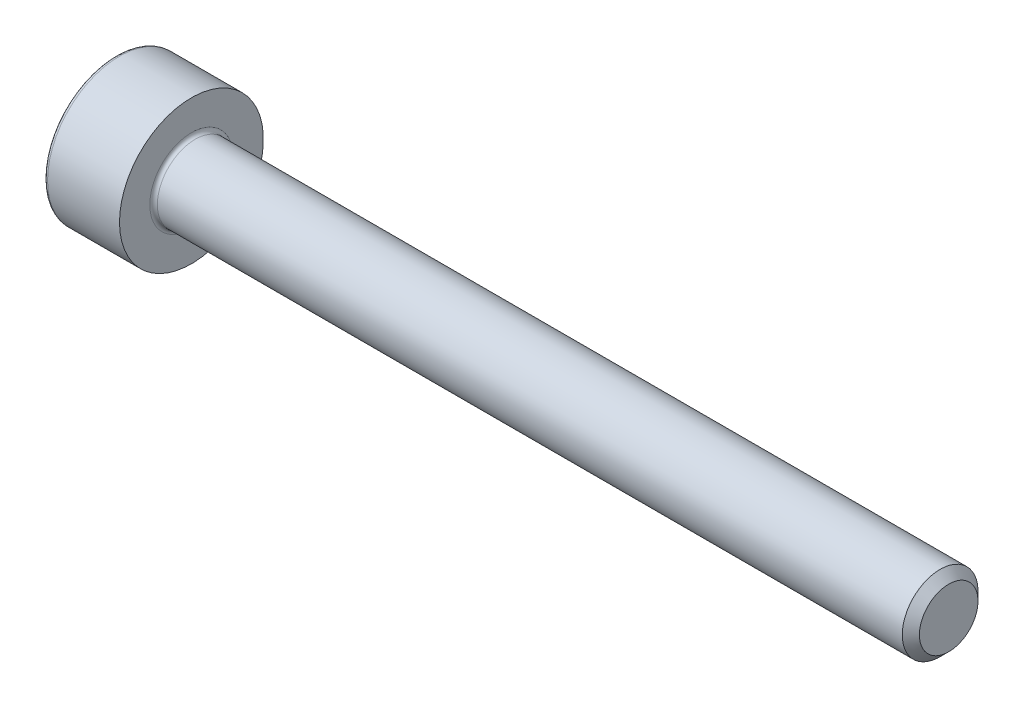
ISO-10303-21;
HEADER;
FILE_DESCRIPTION(('STEP AP214'),'2;1');
FILE_NAME('part.step','',(''),(''),'','','');
FILE_SCHEMA(('AUTOMOTIVE_DESIGN { 1 0 10303 214 1 1 1 1 }'));
ENDSEC;
DATA;
#1=APPLICATION_CONTEXT('core data for automotive mechanical design processes');
#2=APPLICATION_PROTOCOL_DEFINITION('international standard','automotive_design',2000,#1);
#3=PRODUCT_CONTEXT('',#1,'mechanical');
#4=PRODUCT('Part','Part','',(#3));
#5=PRODUCT_RELATED_PRODUCT_CATEGORY('part','',(#4));
#6=PRODUCT_DEFINITION_FORMATION('','',#4);
#7=PRODUCT_DEFINITION_CONTEXT('part definition',#1,'design');
#8=PRODUCT_DEFINITION('design','',#6,#7);
#9=PRODUCT_DEFINITION_SHAPE('','',#8);
#10=(LENGTH_UNIT() NAMED_UNIT(*) SI_UNIT(.MILLI.,.METRE.));
#11=(NAMED_UNIT(*) PLANE_ANGLE_UNIT() SI_UNIT($,.RADIAN.));
#12=(NAMED_UNIT(*) SI_UNIT($,.STERADIAN.) SOLID_ANGLE_UNIT());
#13=UNCERTAINTY_MEASURE_WITH_UNIT(LENGTH_MEASURE(1.E-05),#10,'distance_accuracy_value','');
#14=(GEOMETRIC_REPRESENTATION_CONTEXT(3) GLOBAL_UNCERTAINTY_ASSIGNED_CONTEXT((#13)) GLOBAL_UNIT_ASSIGNED_CONTEXT((#10,
#11,#12)) REPRESENTATION_CONTEXT('',''));
#15=CARTESIAN_POINT('',(0.,0.,0.));
#16=DIRECTION('',(0.,0.,1.));
#17=DIRECTION('',(1.,0.,0.));
#18=AXIS2_PLACEMENT_3D('',#15,#16,#17);
#19=CARTESIAN_POINT('',(0.,0.,0.));
#20=DIRECTION('',(-1.,0.,0.));
#21=DIRECTION('',(0.,0.,1.));
#22=AXIS2_PLACEMENT_3D('',#19,#20,#21);
#23=PLANE('',#22);
#24=DIRECTION('',(0.,-0.5,0.86602540378444));
#25=VECTOR('',#24,1.);
#26=CARTESIAN_POINT('',(0.,0.892006165897969,0.));
#27=LINE('',#26,#25);
#28=CARTESIAN_POINT('',(0.,0.892006165897969,0.));
#29=VERTEX_POINT('',#28);
#30=CARTESIAN_POINT('',(0.,0.446003082948984,0.7725));
#31=VERTEX_POINT('',#30);
#32=EDGE_CURVE('E253',#29,#31,#27,.T.);
#33=ORIENTED_EDGE('',*,*,#32,.T.);
#34=DIRECTION('',(0.,1.,0.));
#35=VECTOR('',#34,1.);
#36=CARTESIAN_POINT('',(0.,-0.446003082948988,0.7725));
#37=LINE('',#36,#35);
#38=CARTESIAN_POINT('',(0.,-0.446003082948988,0.7725));
#39=VERTEX_POINT('',#38);
#40=EDGE_CURVE('E108',#39,#31,#37,.T.);
#41=ORIENTED_EDGE('',*,*,#40,.F.);
#42=DIRECTION('',(0.,-0.5,-0.866025403784438));
#43=VECTOR('',#42,1.);
#44=CARTESIAN_POINT('',(0.,-0.446003082948988,0.7725));
#45=LINE('',#44,#43);
#46=CARTESIAN_POINT('',(0.,-0.892006165897974,0.));
#47=VERTEX_POINT('',#46);
#48=EDGE_CURVE('E256',#39,#47,#45,.T.);
#49=ORIENTED_EDGE('',*,*,#48,.T.);
#50=DIRECTION('',(0.,0.5,-0.86602540378444));
#51=VECTOR('',#50,1.);
#52=CARTESIAN_POINT('',(0.,-0.892006165897974,0.));
#53=LINE('',#52,#51);
#54=CARTESIAN_POINT('',(0.,-0.44600308294899,-0.7725));
#55=VERTEX_POINT('',#54);
#56=EDGE_CURVE('E259',#47,#55,#53,.T.);
#57=ORIENTED_EDGE('',*,*,#56,.T.);
#58=DIRECTION('',(0.,-1.,0.));
#59=VECTOR('',#58,1.);
#60=CARTESIAN_POINT('',(0.,0.446003082948982,-0.7725));
#61=LINE('',#60,#59);
#62=CARTESIAN_POINT('',(0.,0.446003082948982,-0.7725));
#63=VERTEX_POINT('',#62);
#64=EDGE_CURVE('E262',#63,#55,#61,.T.);
#65=ORIENTED_EDGE('',*,*,#64,.F.);
#66=DIRECTION('',(0.,-0.5,-0.866025403784438));
#67=VECTOR('',#66,1.);
#68=CARTESIAN_POINT('',(0.,0.892006165897969,0.));
#69=LINE('',#68,#67);
#70=EDGE_CURVE('E103',#29,#63,#69,.T.);
#71=ORIENTED_EDGE('',*,*,#70,.F.);
#72=EDGE_LOOP('',(#33,#41,#49,#57,#65,#71));
#73=FACE_BOUND('',#72,.T.);
#74=CARTESIAN_POINT('',(0.,0.,0.));
#75=DIRECTION('',(-1.,0.,0.));
#76=DIRECTION('',(0.,0.,1.));
#77=AXIS2_PLACEMENT_3D('',#74,#75,#76);
#78=CIRCLE('',#77,1.8);
#79=CARTESIAN_POINT('',(0.,0.,1.8));
#80=VERTEX_POINT('',#79);
#81=EDGE_CURVE('E24',#80,#80,#78,.T.);
#82=ORIENTED_EDGE('',*,*,#81,.T.);
#83=EDGE_LOOP('',(#82));
#84=FACE_BOUND('',#83,.T.);
#85=ADVANCED_FACE('F16',(#73,#84),#23,.T.);
#86=CARTESIAN_POINT('',(-31.75,0.,0.));
#87=DIRECTION('',(-1.,0.,0.));
#88=DIRECTION('',(0.,0.,1.));
#89=AXIS2_PLACEMENT_3D('',#86,#87,#88);
#90=CYLINDRICAL_SURFACE('',#89,1.9);
#91=CARTESIAN_POINT('',(0.100000000000003,0.,0.));
#92=DIRECTION('',(-1.,0.,0.));
#93=DIRECTION('',(0.,0.,1.));
#94=AXIS2_PLACEMENT_3D('',#91,#92,#93);
#95=CIRCLE('',#94,1.9);
#96=CARTESIAN_POINT('',(0.100000000000003,0.,1.9));
#97=VERTEX_POINT('',#96);
#98=EDGE_CURVE('E11',#97,#97,#95,.F.);
#99=ORIENTED_EDGE('',*,*,#98,.T.);
#100=EDGE_LOOP('',(#99));
#101=FACE_BOUND('',#100,.T.);
#102=CARTESIAN_POINT('',(2.,0.,0.));
#103=DIRECTION('',(-1.,0.,0.));
#104=DIRECTION('',(0.,0.,1.));
#105=AXIS2_PLACEMENT_3D('',#102,#103,#104);
#106=CIRCLE('',#105,1.9);
#107=CARTESIAN_POINT('',(2.,0.,1.9));
#108=VERTEX_POINT('',#107);
#109=EDGE_CURVE('E126',#108,#108,#106,.T.);
#110=ORIENTED_EDGE('',*,*,#109,.T.);
#111=EDGE_LOOP('',(#110));
#112=FACE_BOUND('',#111,.T.);
#113=ADVANCED_FACE('F152',(#101,#112),#90,.T.);
#114=CARTESIAN_POINT('',(2.,1.9,0.));
#115=DIRECTION('',(1.,0.,0.));
#116=DIRECTION('',(0.,0.,-1.));
#117=AXIS2_PLACEMENT_3D('',#114,#115,#116);
#118=PLANE('',#117);
#119=CARTESIAN_POINT('',(2.,0.,0.));
#120=DIRECTION('',(1.,0.,0.));
#121=DIRECTION('',(0.,0.,-1.));
#122=AXIS2_PLACEMENT_3D('',#119,#120,#121);
#123=CIRCLE('',#122,1.1);
#124=CARTESIAN_POINT('',(2.,0.,-1.1));
#125=VERTEX_POINT('',#124);
#126=EDGE_CURVE('E129',#125,#125,#123,.F.);
#127=ORIENTED_EDGE('',*,*,#126,.T.);
#128=EDGE_LOOP('',(#127));
#129=FACE_BOUND('',#128,.T.);
#130=ORIENTED_EDGE('',*,*,#109,.F.);
#131=EDGE_LOOP('',(#130));
#132=FACE_BOUND('',#131,.T.);
#133=ADVANCED_FACE('F159',(#129,#132),#118,.T.);
#134=CARTESIAN_POINT('',(-31.75,0.,0.));
#135=DIRECTION('',(-1.,0.,0.));
#136=DIRECTION('',(0.,0.,1.));
#137=AXIS2_PLACEMENT_3D('',#134,#135,#136);
#138=CYLINDRICAL_SURFACE('',#137,1.);
#139=CARTESIAN_POINT('',(2.1,0.,0.));
#140=DIRECTION('',(1.,0.,0.));
#141=DIRECTION('',(0.,0.,-1.));
#142=AXIS2_PLACEMENT_3D('',#139,#140,#141);
#143=CIRCLE('',#142,1.);
#144=CARTESIAN_POINT('',(2.1,0.,-1.));
#145=VERTEX_POINT('',#144);
#146=EDGE_CURVE('E132',#145,#145,#143,.T.);
#147=ORIENTED_EDGE('',*,*,#146,.T.);
#148=EDGE_LOOP('',(#147));
#149=FACE_BOUND('',#148,.T.);
#150=CARTESIAN_POINT('',(21.774,0.,0.));
#151=DIRECTION('',(-1.,0.,0.));
#152=DIRECTION('',(0.,0.,1.));
#153=AXIS2_PLACEMENT_3D('',#150,#151,#152);
#154=CIRCLE('',#153,0.999999999999987);
#155=CARTESIAN_POINT('',(21.774,0.,0.999999999999987));
#156=VERTEX_POINT('',#155);
#157=EDGE_CURVE('E123',#156,#156,#154,.T.);
#158=ORIENTED_EDGE('',*,*,#157,.T.);
#159=EDGE_LOOP('',(#158));
#160=FACE_BOUND('',#159,.T.);
#161=ADVANCED_FACE('F165',(#149,#160),#138,.T.);
#162=CARTESIAN_POINT('',(22.,0.,0.));
#163=DIRECTION('',(-1.,0.,0.));
#164=DIRECTION('',(0.,0.,1.));
#165=AXIS2_PLACEMENT_3D('',#162,#163,#164);
#166=CONICAL_SURFACE('',#165,0.774,0.785398163397411);
#167=ORIENTED_EDGE('',*,*,#157,.F.);
#168=EDGE_LOOP('',(#167));
#169=FACE_BOUND('',#168,.T.);
#170=CARTESIAN_POINT('',(22.,0.,0.));
#171=DIRECTION('',(-1.,0.,0.));
#172=DIRECTION('',(0.,0.,1.));
#173=AXIS2_PLACEMENT_3D('',#170,#171,#172);
#174=CIRCLE('',#173,0.774);
#175=CARTESIAN_POINT('',(22.,0.,0.774));
#176=VERTEX_POINT('',#175);
#177=EDGE_CURVE('E119',#176,#176,#174,.T.);
#178=ORIENTED_EDGE('',*,*,#177,.T.);
#179=EDGE_LOOP('',(#178));
#180=FACE_BOUND('',#179,.T.);
#181=ADVANCED_FACE('F169',(#169,#180),#166,.T.);
#182=CARTESIAN_POINT('',(22.,0.774,0.));
#183=DIRECTION('',(1.,0.,0.));
#184=DIRECTION('',(0.,0.,-1.));
#185=AXIS2_PLACEMENT_3D('',#182,#183,#184);
#186=PLANE('',#185);
#187=ORIENTED_EDGE('',*,*,#177,.F.);
#188=EDGE_LOOP('',(#187));
#189=FACE_BOUND('',#188,.T.);
#190=ADVANCED_FACE('F148',(#189),#186,.T.);
#191=CARTESIAN_POINT('',(2.1,0.,0.));
#192=DIRECTION('',(1.,0.,0.));
#193=DIRECTION('',(0.,0.,-1.));
#194=AXIS2_PLACEMENT_3D('',#191,#192,#193);
#195=TOROIDAL_SURFACE('',#194,1.1,0.1);
#196=ORIENTED_EDGE('',*,*,#146,.F.);
#197=EDGE_LOOP('',(#196));
#198=FACE_BOUND('',#197,.T.);
#199=ORIENTED_EDGE('',*,*,#126,.F.);
#200=EDGE_LOOP('',(#199));
#201=FACE_BOUND('',#200,.T.);
#202=ADVANCED_FACE('F139',(#198,#201),#195,.F.);
#203=CARTESIAN_POINT('',(0.100000000000003,0.,0.));
#204=DIRECTION('',(-1.,0.,0.));
#205=DIRECTION('',(0.,0.,1.));
#206=AXIS2_PLACEMENT_3D('',#203,#204,#205);
#207=TOROIDAL_SURFACE('',#206,1.8,0.1);
#208=ORIENTED_EDGE('',*,*,#98,.F.);
#209=EDGE_LOOP('',(#208));
#210=FACE_BOUND('',#209,.T.);
#211=ORIENTED_EDGE('',*,*,#81,.F.);
#212=EDGE_LOOP('',(#211));
#213=FACE_BOUND('',#212,.T.);
#214=ADVANCED_FACE('F18',(#210,#213),#207,.T.);
#215=CARTESIAN_POINT('',(1.,0.892006165897969,0.));
#216=DIRECTION('',(0.,-0.86602540378444,-0.5));
#217=DIRECTION('',(0.,0.5,-0.86602540378444));
#218=AXIS2_PLACEMENT_3D('',#215,#216,#217);
#219=PLANE('',#218);
#220=ORIENTED_EDGE('',*,*,#32,.F.);
#221=DIRECTION('',(-1.,0.,0.));
#222=VECTOR('',#221,1.);
#223=CARTESIAN_POINT('',(1.,0.892006165897969,0.));
#224=LINE('',#223,#222);
#225=CARTESIAN_POINT('',(1.,0.892006165897969,0.));
#226=VERTEX_POINT('',#225);
#227=EDGE_CURVE('E252',#226,#29,#224,.T.);
#228=ORIENTED_EDGE('',*,*,#227,.F.);
#229=DIRECTION('',(0.,-0.5,0.86602540378444));
#230=VECTOR('',#229,1.);
#231=CARTESIAN_POINT('',(1.,0.892006165897969,0.));
#232=LINE('',#231,#230);
#233=CARTESIAN_POINT('',(1.,0.66900462442348,0.38625));
#234=VERTEX_POINT('',#233);
#235=EDGE_CURVE('E31',#226,#234,#232,.T.);
#236=ORIENTED_EDGE('',*,*,#235,.T.);
#237=CARTESIAN_POINT('',(1.,0.446003082948984,0.7725));
#238=VERTEX_POINT('',#237);
#239=EDGE_CURVE('E89',#234,#238,#232,.T.);
#240=ORIENTED_EDGE('',*,*,#239,.T.);
#241=DIRECTION('',(-1.,0.,0.));
#242=VECTOR('',#241,1.);
#243=CARTESIAN_POINT('',(1.,0.446003082948984,0.7725));
#244=LINE('',#243,#242);
#245=EDGE_CURVE('E101',#238,#31,#244,.T.);
#246=ORIENTED_EDGE('',*,*,#245,.T.);
#247=EDGE_LOOP('',(#220,#228,#236,#240,#246));
#248=FACE_BOUND('',#247,.T.);
#249=ADVANCED_FACE('F100',(#248),#219,.T.);
#250=CARTESIAN_POINT('',(1.,-0.446003082948988,0.7725));
#251=DIRECTION('',(0.,0.,1.));
#252=DIRECTION('',(0.,-1.,0.));
#253=AXIS2_PLACEMENT_3D('',#250,#251,#252);
#254=PLANE('',#253);
#255=ORIENTED_EDGE('',*,*,#40,.T.);
#256=ORIENTED_EDGE('',*,*,#245,.F.);
#257=DIRECTION('',(0.,1.,0.));
#258=VECTOR('',#257,1.);
#259=CARTESIAN_POINT('',(1.,-0.446003082948988,0.7725));
#260=LINE('',#259,#258);
#261=CARTESIAN_POINT('',(1.,0.,0.7725));
#262=VERTEX_POINT('',#261);
#263=EDGE_CURVE('E87',#262,#238,#260,.T.);
#264=ORIENTED_EDGE('',*,*,#263,.F.);
#265=CARTESIAN_POINT('',(1.,-0.446003082948988,0.7725));
#266=VERTEX_POINT('',#265);
#267=EDGE_CURVE('E97',#266,#262,#260,.T.);
#268=ORIENTED_EDGE('',*,*,#267,.F.);
#269=DIRECTION('',(-1.,0.,0.));
#270=VECTOR('',#269,1.);
#271=CARTESIAN_POINT('',(1.,-0.446003082948988,0.7725));
#272=LINE('',#271,#270);
#273=EDGE_CURVE('E110',#266,#39,#272,.T.);
#274=ORIENTED_EDGE('',*,*,#273,.T.);
#275=EDGE_LOOP('',(#255,#256,#264,#268,#274));
#276=FACE_BOUND('',#275,.T.);
#277=ADVANCED_FACE('F105',(#276),#254,.F.);
#278=CARTESIAN_POINT('',(1.,-0.446003082948988,0.7725));
#279=DIRECTION('',(0.,0.866025403784438,-0.5));
#280=DIRECTION('',(0.,0.5,0.866025403784438));
#281=AXIS2_PLACEMENT_3D('',#278,#279,#280);
#282=PLANE('',#281);
#283=ORIENTED_EDGE('',*,*,#48,.F.);
#284=ORIENTED_EDGE('',*,*,#273,.F.);
#285=DIRECTION('',(0.,-0.5,-0.866025403784438));
#286=VECTOR('',#285,1.);
#287=CARTESIAN_POINT('',(1.,-0.446003082948988,0.7725));
#288=LINE('',#287,#286);
#289=CARTESIAN_POINT('',(1.,-0.669004624423479,0.38625));
#290=VERTEX_POINT('',#289);
#291=EDGE_CURVE('E233',#266,#290,#288,.T.);
#292=ORIENTED_EDGE('',*,*,#291,.T.);
#293=CARTESIAN_POINT('',(1.,-0.892006165897974,0.));
#294=VERTEX_POINT('',#293);
#295=EDGE_CURVE('E235',#290,#294,#288,.T.);
#296=ORIENTED_EDGE('',*,*,#295,.T.);
#297=DIRECTION('',(-1.,0.,0.));
#298=VECTOR('',#297,1.);
#299=CARTESIAN_POINT('',(1.,-0.892006165897974,0.));
#300=LINE('',#299,#298);
#301=EDGE_CURVE('E115',#294,#47,#300,.T.);
#302=ORIENTED_EDGE('',*,*,#301,.T.);
#303=EDGE_LOOP('',(#283,#284,#292,#296,#302));
#304=FACE_BOUND('',#303,.T.);
#305=ADVANCED_FACE('F182',(#304),#282,.T.);
#306=CARTESIAN_POINT('',(1.,-0.892006165897974,0.));
#307=DIRECTION('',(0.,0.86602540378444,0.5));
#308=DIRECTION('',(0.,-0.5,0.86602540378444));
#309=AXIS2_PLACEMENT_3D('',#306,#307,#308);
#310=PLANE('',#309);
#311=ORIENTED_EDGE('',*,*,#56,.F.);
#312=ORIENTED_EDGE('',*,*,#301,.F.);
#313=DIRECTION('',(0.,0.5,-0.86602540378444));
#314=VECTOR('',#313,1.);
#315=CARTESIAN_POINT('',(1.,-0.892006165897974,0.));
#316=LINE('',#315,#314);
#317=CARTESIAN_POINT('',(1.,-0.669004624423483,-0.38625));
#318=VERTEX_POINT('',#317);
#319=EDGE_CURVE('E238',#294,#318,#316,.T.);
#320=ORIENTED_EDGE('',*,*,#319,.T.);
#321=CARTESIAN_POINT('',(1.,-0.44600308294899,-0.7725));
#322=VERTEX_POINT('',#321);
#323=EDGE_CURVE('E242',#318,#322,#316,.T.);
#324=ORIENTED_EDGE('',*,*,#323,.T.);
#325=DIRECTION('',(-1.,0.,0.));
#326=VECTOR('',#325,1.);
#327=CARTESIAN_POINT('',(1.,-0.44600308294899,-0.7725));
#328=LINE('',#327,#326);
#329=EDGE_CURVE('E271',#322,#55,#328,.T.);
#330=ORIENTED_EDGE('',*,*,#329,.T.);
#331=EDGE_LOOP('',(#311,#312,#320,#324,#330));
#332=FACE_BOUND('',#331,.T.);
#333=ADVANCED_FACE('F185',(#332),#310,.T.);
#334=CARTESIAN_POINT('',(1.,0.446003082948982,-0.7725));
#335=DIRECTION('',(0.,0.,-1.));
#336=DIRECTION('',(0.,1.,0.));
#337=AXIS2_PLACEMENT_3D('',#334,#335,#336);
#338=PLANE('',#337);
#339=ORIENTED_EDGE('',*,*,#64,.T.);
#340=ORIENTED_EDGE('',*,*,#329,.F.);
#341=DIRECTION('',(0.,-1.,0.));
#342=VECTOR('',#341,1.);
#343=CARTESIAN_POINT('',(1.,0.446003082948982,-0.7725));
#344=LINE('',#343,#342);
#345=CARTESIAN_POINT('',(1.,0.,-0.7725));
#346=VERTEX_POINT('',#345);
#347=EDGE_CURVE('E246',#346,#322,#344,.T.);
#348=ORIENTED_EDGE('',*,*,#347,.F.);
#349=CARTESIAN_POINT('',(1.,0.446003082948982,-0.7725));
#350=VERTEX_POINT('',#349);
#351=EDGE_CURVE('E247',#350,#346,#344,.T.);
#352=ORIENTED_EDGE('',*,*,#351,.F.);
#353=DIRECTION('',(-1.,0.,0.));
#354=VECTOR('',#353,1.);
#355=CARTESIAN_POINT('',(1.,0.446003082948982,-0.7725));
#356=LINE('',#355,#354);
#357=EDGE_CURVE('E268',#350,#63,#356,.T.);
#358=ORIENTED_EDGE('',*,*,#357,.T.);
#359=EDGE_LOOP('',(#339,#340,#348,#352,#358));
#360=FACE_BOUND('',#359,.T.);
#361=ADVANCED_FACE('F189',(#360),#338,.F.);
#362=CARTESIAN_POINT('',(1.,0.892006165897969,0.));
#363=DIRECTION('',(0.,0.866025403784438,-0.5));
#364=DIRECTION('',(0.,0.5,0.866025403784438));
#365=AXIS2_PLACEMENT_3D('',#362,#363,#364);
#366=PLANE('',#365);
#367=ORIENTED_EDGE('',*,*,#70,.T.);
#368=ORIENTED_EDGE('',*,*,#357,.F.);
#369=DIRECTION('',(0.,-0.5,-0.866025403784438));
#370=VECTOR('',#369,1.);
#371=CARTESIAN_POINT('',(1.,0.892006165897969,0.));
#372=LINE('',#371,#370);
#373=CARTESIAN_POINT('',(1.,0.669004624423477,-0.38625));
#374=VERTEX_POINT('',#373);
#375=EDGE_CURVE('E250',#374,#350,#372,.T.);
#376=ORIENTED_EDGE('',*,*,#375,.F.);
#377=EDGE_CURVE('E224',#226,#374,#372,.T.);
#378=ORIENTED_EDGE('',*,*,#377,.F.);
#379=ORIENTED_EDGE('',*,*,#227,.T.);
#380=EDGE_LOOP('',(#367,#368,#376,#378,#379));
#381=FACE_BOUND('',#380,.T.);
#382=ADVANCED_FACE('F193',(#381),#366,.F.);
#383=CARTESIAN_POINT('',(1.,0.446003082948983,0.7725));
#384=DIRECTION('',(-1.,0.,0.));
#385=DIRECTION('',(0.,0.,1.));
#386=AXIS2_PLACEMENT_3D('',#383,#384,#385);
#387=PLANE('',#386);
#388=CARTESIAN_POINT('',(1.,0.,0.));
#389=DIRECTION('',(-1.,0.,0.));
#390=DIRECTION('',(0.,0.,1.));
#391=AXIS2_PLACEMENT_3D('',#388,#389,#390);
#392=CIRCLE('',#391,0.7725);
#393=EDGE_CURVE('E109',#290,#262,#392,.T.);
#394=ORIENTED_EDGE('',*,*,#393,.F.);
#395=ORIENTED_EDGE('',*,*,#291,.F.);
#396=ORIENTED_EDGE('',*,*,#267,.T.);
#397=EDGE_LOOP('',(#394,#395,#396));
#398=FACE_BOUND('',#397,.T.);
#399=ADVANCED_FACE('F197',(#398),#387,.T.);
#400=EDGE_CURVE('E113',#318,#290,#392,.T.);
#401=ORIENTED_EDGE('',*,*,#400,.F.);
#402=ORIENTED_EDGE('',*,*,#319,.F.);
#403=ORIENTED_EDGE('',*,*,#295,.F.);
#404=EDGE_LOOP('',(#401,#402,#403));
#405=FACE_BOUND('',#404,.T.);
#406=ADVANCED_FACE('F200',(#405),#387,.T.);
#407=EDGE_CURVE('E277',#346,#318,#392,.T.);
#408=ORIENTED_EDGE('',*,*,#407,.F.);
#409=ORIENTED_EDGE('',*,*,#347,.T.);
#410=ORIENTED_EDGE('',*,*,#323,.F.);
#411=EDGE_LOOP('',(#408,#409,#410));
#412=FACE_BOUND('',#411,.T.);
#413=ADVANCED_FACE('F206',(#412),#387,.T.);
#414=EDGE_CURVE('E227',#374,#346,#392,.T.);
#415=ORIENTED_EDGE('',*,*,#414,.F.);
#416=ORIENTED_EDGE('',*,*,#375,.T.);
#417=ORIENTED_EDGE('',*,*,#351,.T.);
#418=EDGE_LOOP('',(#415,#416,#417));
#419=FACE_BOUND('',#418,.T.);
#420=ADVANCED_FACE('F214',(#419),#387,.T.);
#421=EDGE_CURVE('E120',#234,#374,#392,.T.);
#422=ORIENTED_EDGE('',*,*,#421,.F.);
#423=ORIENTED_EDGE('',*,*,#235,.F.);
#424=ORIENTED_EDGE('',*,*,#377,.T.);
#425=EDGE_LOOP('',(#422,#423,#424));
#426=FACE_BOUND('',#425,.T.);
#427=ADVANCED_FACE('F209',(#426),#387,.T.);
#428=EDGE_CURVE('E92',#262,#234,#392,.T.);
#429=ORIENTED_EDGE('',*,*,#428,.F.);
#430=ORIENTED_EDGE('',*,*,#263,.T.);
#431=ORIENTED_EDGE('',*,*,#239,.F.);
#432=EDGE_LOOP('',(#429,#430,#431));
#433=FACE_BOUND('',#432,.T.);
#434=ADVANCED_FACE('F88',(#433),#387,.T.);
#435=CARTESIAN_POINT('',(1.,0.,0.));
#436=DIRECTION('',(-1.,0.,0.));
#437=DIRECTION('',(0.,0.,1.));
#438=AXIS2_PLACEMENT_3D('',#435,#436,#437);
#439=CONICAL_SURFACE('',#438,0.7725,1.04719755119659);
#440=CARTESIAN_POINT('',(1.446003082949,0.,0.));
#441=VERTEX_POINT('',#440);
#442=VERTEX_LOOP('',#441);
#443=FACE_BOUND('',#442,.T.);
#444=ORIENTED_EDGE('',*,*,#428,.T.);
#445=ORIENTED_EDGE('',*,*,#421,.T.);
#446=ORIENTED_EDGE('',*,*,#414,.T.);
#447=ORIENTED_EDGE('',*,*,#407,.T.);
#448=ORIENTED_EDGE('',*,*,#400,.T.);
#449=ORIENTED_EDGE('',*,*,#393,.T.);
#450=EDGE_LOOP('',(#444,#445,#446,#447,#448,#449));
#451=FACE_BOUND('',#450,.T.);
#452=ADVANCED_FACE('F177',(#443,#451),#439,.F.);
#453=CLOSED_SHELL('',(#85,#113,#133,#161,#181,#190,#202,#214,#249,#277,#305,#333,#361,#382,#399,
#406,#413,#420,#427,#434,#452));
#454=MANIFOLD_SOLID_BREP('B1',#453);
#455=ADVANCED_BREP_SHAPE_REPRESENTATION('',(#18,#454),#14);
#456=SHAPE_DEFINITION_REPRESENTATION(#9,#455);
ENDSEC;
END-ISO-10303-21;
